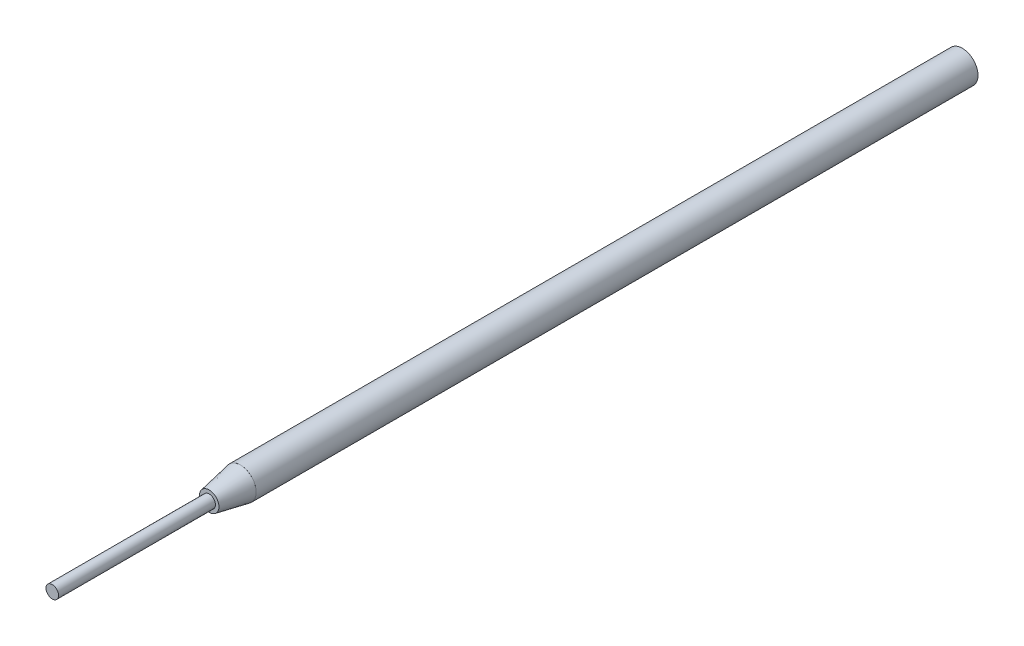
ISO-10303-21;
HEADER;
FILE_DESCRIPTION(('STEP AP214'),'2;1');
FILE_NAME('part.step','',(''),(''),'','','');
FILE_SCHEMA(('AUTOMOTIVE_DESIGN { 1 0 10303 214 1 1 1 1 }'));
ENDSEC;
DATA;
#1=APPLICATION_CONTEXT('core data for automotive mechanical design processes');
#2=APPLICATION_PROTOCOL_DEFINITION('international standard','automotive_design',2000,#1);
#3=PRODUCT_CONTEXT('',#1,'mechanical');
#4=PRODUCT('Part','Part','',(#3));
#5=PRODUCT_RELATED_PRODUCT_CATEGORY('part','',(#4));
#6=PRODUCT_DEFINITION_FORMATION('','',#4);
#7=PRODUCT_DEFINITION_CONTEXT('part definition',#1,'design');
#8=PRODUCT_DEFINITION('design','',#6,#7);
#9=PRODUCT_DEFINITION_SHAPE('','',#8);
#10=(LENGTH_UNIT() NAMED_UNIT(*) SI_UNIT(.MILLI.,.METRE.));
#11=(NAMED_UNIT(*) PLANE_ANGLE_UNIT() SI_UNIT($,.RADIAN.));
#12=(NAMED_UNIT(*) SI_UNIT($,.STERADIAN.) SOLID_ANGLE_UNIT());
#13=UNCERTAINTY_MEASURE_WITH_UNIT(LENGTH_MEASURE(1.E-05),#10,'distance_accuracy_value','');
#14=(GEOMETRIC_REPRESENTATION_CONTEXT(3) GLOBAL_UNCERTAINTY_ASSIGNED_CONTEXT((#13)) GLOBAL_UNIT_ASSIGNED_CONTEXT((#10,
#11,#12)) REPRESENTATION_CONTEXT('',''));
#15=CARTESIAN_POINT('',(0.,0.,0.));
#16=DIRECTION('',(0.,0.,1.));
#17=DIRECTION('',(1.,0.,0.));
#18=AXIS2_PLACEMENT_3D('',#15,#16,#17);
#19=CARTESIAN_POINT('',(0.,0.,144.986221679994));
#20=DIRECTION('',(0.,0.,-1.));
#21=DIRECTION('',(-1.,0.,0.));
#22=AXIS2_PLACEMENT_3D('',#19,#20,#21);
#23=CYLINDRICAL_SURFACE('',#22,1.);
#24=CARTESIAN_POINT('',(0.,0.,144.986221679994));
#25=DIRECTION('',(0.,0.,1.));
#26=DIRECTION('',(1.,0.,0.));
#27=AXIS2_PLACEMENT_3D('',#24,#25,#26);
#28=CIRCLE('',#27,1.);
#29=CARTESIAN_POINT('',(1.,0.,144.986221679994));
#30=VERTEX_POINT('',#29);
#31=EDGE_CURVE('E11',#30,#30,#28,.F.);
#32=ORIENTED_EDGE('',*,*,#31,.T.);
#33=EDGE_LOOP('',(#32));
#34=FACE_BOUND('',#33,.T.);
#35=CARTESIAN_POINT('',(0.,0.,119.986221679994));
#36=DIRECTION('',(0.,0.,1.));
#37=DIRECTION('',(1.,0.,0.));
#38=AXIS2_PLACEMENT_3D('',#35,#36,#37);
#39=CIRCLE('',#38,1.);
#40=CARTESIAN_POINT('',(1.,0.,119.986221679994));
#41=VERTEX_POINT('',#40);
#42=EDGE_CURVE('E49',#41,#41,#39,.F.);
#43=ORIENTED_EDGE('',*,*,#42,.F.);
#44=EDGE_LOOP('',(#43));
#45=FACE_BOUND('',#44,.T.);
#46=ADVANCED_FACE('F46',(#34,#45),#23,.T.);
#47=CARTESIAN_POINT('',(0.,0.,144.986221679994));
#48=DIRECTION('',(0.,0.,1.));
#49=DIRECTION('',(1.,0.,0.));
#50=AXIS2_PLACEMENT_3D('',#47,#48,#49);
#51=PLANE('',#50);
#52=ORIENTED_EDGE('',*,*,#31,.F.);
#53=EDGE_LOOP('',(#52));
#54=FACE_BOUND('',#53,.T.);
#55=ADVANCED_FACE('F61',(#54),#51,.T.);
#56=CARTESIAN_POINT('',(0.,0.,119.986221679994));
#57=DIRECTION('',(0.,0.,1.));
#58=DIRECTION('',(1.,0.,0.));
#59=AXIS2_PLACEMENT_3D('',#56,#57,#58);
#60=PLANE('',#59);
#61=ORIENTED_EDGE('',*,*,#42,.T.);
#62=EDGE_LOOP('',(#61));
#63=FACE_BOUND('',#62,.T.);
#64=ADVANCED_FACE('F58',(#63),#60,.F.);
#65=CLOSED_SHELL('',(#46,#55,#64));
#66=MANIFOLD_SOLID_BREP('B2',#65);
#67=CARTESIAN_POINT('',(-2.49999999999999,0.,115.007064781541));
#68=DIRECTION('',(0.,0.,-1.));
#69=DIRECTION('',(-1.,0.,0.));
#70=AXIS2_PLACEMENT_3D('',#67,#68,#69);
#71=PLANE('',#70);
#72=CARTESIAN_POINT('',(0.,0.,115.007064781541));
#73=DIRECTION('',(0.,0.,-1.));
#74=DIRECTION('',(-1.,0.,0.));
#75=AXIS2_PLACEMENT_3D('',#72,#73,#74);
#76=CIRCLE('',#75,2.49999999999999);
#77=CARTESIAN_POINT('',(-2.49999999999999,0.,115.007064781541));
#78=VERTEX_POINT('',#77);
#79=EDGE_CURVE('E108',#78,#78,#76,.T.);
#80=ORIENTED_EDGE('',*,*,#79,.T.);
#81=EDGE_LOOP('',(#80));
#82=FACE_BOUND('',#81,.T.);
#83=CARTESIAN_POINT('',(0.,0.,115.007064781541));
#84=DIRECTION('',(0.,0.,-1.));
#85=DIRECTION('',(-1.,0.,0.));
#86=AXIS2_PLACEMENT_3D('',#83,#84,#85);
#87=CIRCLE('',#86,1.94711273291867);
#88=CARTESIAN_POINT('',(-1.94711273291867,0.,115.007064781541));
#89=VERTEX_POINT('',#88);
#90=EDGE_CURVE('E45',#89,#89,#87,.T.);
#91=ORIENTED_EDGE('',*,*,#90,.F.);
#92=EDGE_LOOP('',(#91));
#93=FACE_BOUND('',#92,.T.);
#94=ADVANCED_FACE('F94',(#82,#93),#71,.T.);
#95=CARTESIAN_POINT('',(0.,0.,119.986221679994));
#96=DIRECTION('',(0.,0.,-1.));
#97=DIRECTION('',(-1.,0.,0.));
#98=AXIS2_PLACEMENT_3D('',#95,#96,#97);
#99=CONICAL_SURFACE('',#98,1.,0.187969913109964);
#100=ORIENTED_EDGE('',*,*,#90,.T.);
#101=EDGE_LOOP('',(#100));
#102=FACE_BOUND('',#101,.T.);
#103=CARTESIAN_POINT('',(0.,0.,119.986221679994));
#104=DIRECTION('',(0.,0.,-1.));
#105=DIRECTION('',(-1.,0.,0.));
#106=AXIS2_PLACEMENT_3D('',#103,#104,#105);
#107=CIRCLE('',#106,1.);
#108=CARTESIAN_POINT('',(-1.,0.,119.986221679994));
#109=VERTEX_POINT('',#108);
#110=EDGE_CURVE('E100',#109,#109,#107,.T.);
#111=ORIENTED_EDGE('',*,*,#110,.F.);
#112=EDGE_LOOP('',(#111));
#113=FACE_BOUND('',#112,.T.);
#114=ADVANCED_FACE('F124',(#102,#113),#99,.F.);
#115=CARTESIAN_POINT('',(-1.,0.,119.986221679994));
#116=DIRECTION('',(0.,0.,1.));
#117=DIRECTION('',(1.,0.,0.));
#118=AXIS2_PLACEMENT_3D('',#115,#116,#117);
#119=PLANE('',#118);
#120=ORIENTED_EDGE('',*,*,#110,.T.);
#121=EDGE_LOOP('',(#120));
#122=FACE_BOUND('',#121,.T.);
#123=CARTESIAN_POINT('',(0.,0.,119.986221679994));
#124=DIRECTION('',(0.,0.,-1.));
#125=DIRECTION('',(-1.,0.,0.));
#126=AXIS2_PLACEMENT_3D('',#123,#124,#125);
#127=CIRCLE('',#126,1.55288726708132);
#128=CARTESIAN_POINT('',(-1.55288726708132,0.,119.986221679994));
#129=VERTEX_POINT('',#128);
#130=EDGE_CURVE('E104',#129,#129,#127,.T.);
#131=ORIENTED_EDGE('',*,*,#130,.F.);
#132=EDGE_LOOP('',(#131));
#133=FACE_BOUND('',#132,.T.);
#134=ADVANCED_FACE('F118',(#122,#133),#119,.T.);
#135=CARTESIAN_POINT('',(0.,0.,115.007064781541));
#136=DIRECTION('',(0.,0.,-1.));
#137=DIRECTION('',(-1.,0.,0.));
#138=AXIS2_PLACEMENT_3D('',#135,#136,#137);
#139=CONICAL_SURFACE('',#138,2.49999999999999,0.187969913109963);
#140=ORIENTED_EDGE('',*,*,#130,.T.);
#141=EDGE_LOOP('',(#140));
#142=FACE_BOUND('',#141,.T.);
#143=ORIENTED_EDGE('',*,*,#79,.F.);
#144=EDGE_LOOP('',(#143));
#145=FACE_BOUND('',#144,.T.);
#146=ADVANCED_FACE('F116',(#142,#145),#139,.T.);
#147=CLOSED_SHELL('',(#94,#114,#134,#146));
#148=MANIFOLD_SOLID_BREP('B6',#147);
#149=CARTESIAN_POINT('',(0.,0.,115.));
#150=DIRECTION('',(0.,0.,-1.));
#151=DIRECTION('',(-1.,0.,0.));
#152=AXIS2_PLACEMENT_3D('',#149,#150,#151);
#153=CYLINDRICAL_SURFACE('',#152,2.5);
#154=CARTESIAN_POINT('',(0.,0.,115.));
#155=DIRECTION('',(0.,0.,1.));
#156=DIRECTION('',(1.,0.,0.));
#157=AXIS2_PLACEMENT_3D('',#154,#155,#156);
#158=CIRCLE('',#157,2.5);
#159=CARTESIAN_POINT('',(2.5,0.,115.));
#160=VERTEX_POINT('',#159);
#161=EDGE_CURVE('E93',#160,#160,#158,.T.);
#162=ORIENTED_EDGE('',*,*,#161,.F.);
#163=EDGE_LOOP('',(#162));
#164=FACE_BOUND('',#163,.T.);
#165=CARTESIAN_POINT('',(0.,0.,0.));
#166=DIRECTION('',(0.,0.,1.));
#167=DIRECTION('',(1.,0.,0.));
#168=AXIS2_PLACEMENT_3D('',#165,#166,#167);
#169=CIRCLE('',#168,2.5);
#170=CARTESIAN_POINT('',(2.5,0.,0.));
#171=VERTEX_POINT('',#170);
#172=EDGE_CURVE('E159',#171,#171,#169,.T.);
#173=ORIENTED_EDGE('',*,*,#172,.T.);
#174=EDGE_LOOP('',(#173));
#175=FACE_BOUND('',#174,.T.);
#176=ADVANCED_FACE('F156',(#164,#175),#153,.T.);
#177=CARTESIAN_POINT('',(0.,0.,115.));
#178=DIRECTION('',(0.,0.,1.));
#179=DIRECTION('',(1.,0.,0.));
#180=AXIS2_PLACEMENT_3D('',#177,#178,#179);
#181=PLANE('',#180);
#182=ORIENTED_EDGE('',*,*,#161,.T.);
#183=EDGE_LOOP('',(#182));
#184=FACE_BOUND('',#183,.T.);
#185=ADVANCED_FACE('F171',(#184),#181,.T.);
#186=CARTESIAN_POINT('',(0.,0.,0.));
#187=DIRECTION('',(0.,0.,1.));
#188=DIRECTION('',(1.,0.,0.));
#189=AXIS2_PLACEMENT_3D('',#186,#187,#188);
#190=PLANE('',#189);
#191=ORIENTED_EDGE('',*,*,#172,.F.);
#192=EDGE_LOOP('',(#191));
#193=FACE_BOUND('',#192,.T.);
#194=ADVANCED_FACE('F169',(#193),#190,.F.);
#195=CLOSED_SHELL('',(#176,#185,#194));
#196=MANIFOLD_SOLID_BREP('B40',#195);
#197=ADVANCED_BREP_SHAPE_REPRESENTATION('',(#18,#66,#148,#196),#14);
#198=SHAPE_DEFINITION_REPRESENTATION(#9,#197);
ENDSEC;
END-ISO-10303-21;
